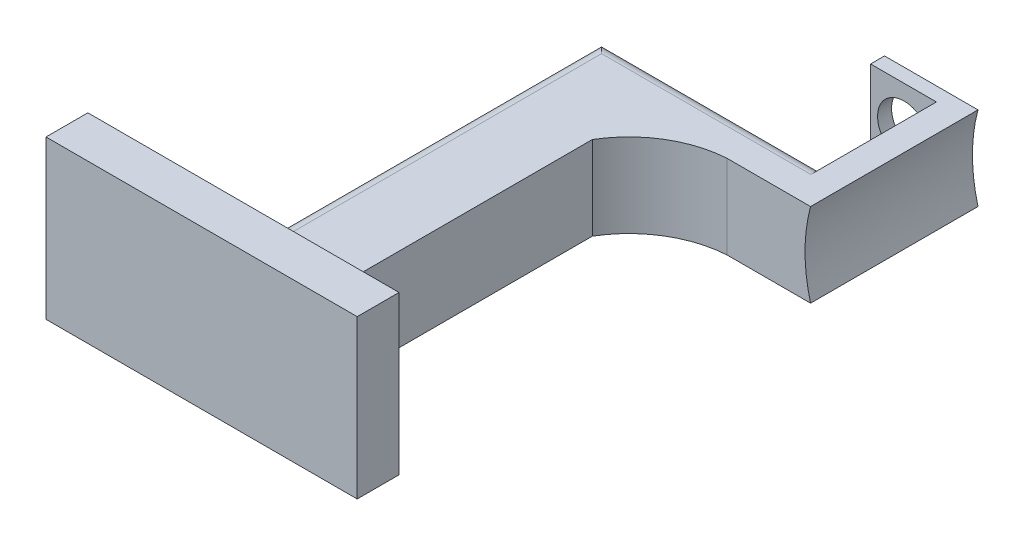
ISO-10303-21;
HEADER;
FILE_DESCRIPTION(('STEP AP214'),'2;1');
FILE_NAME('part.step','',(''),(''),'','','');
FILE_SCHEMA(('AUTOMOTIVE_DESIGN { 1 0 10303 214 1 1 1 1 }'));
ENDSEC;
DATA;
#1=APPLICATION_CONTEXT('core data for automotive mechanical design processes');
#2=APPLICATION_PROTOCOL_DEFINITION('international standard','automotive_design',2000,#1);
#3=PRODUCT_CONTEXT('',#1,'mechanical');
#4=PRODUCT('Part','Part','',(#3));
#5=PRODUCT_RELATED_PRODUCT_CATEGORY('part','',(#4));
#6=PRODUCT_DEFINITION_FORMATION('','',#4);
#7=PRODUCT_DEFINITION_CONTEXT('part definition',#1,'design');
#8=PRODUCT_DEFINITION('design','',#6,#7);
#9=PRODUCT_DEFINITION_SHAPE('','',#8);
#10=(LENGTH_UNIT() NAMED_UNIT(*) SI_UNIT(.MILLI.,.METRE.));
#11=(NAMED_UNIT(*) PLANE_ANGLE_UNIT() SI_UNIT($,.RADIAN.));
#12=(NAMED_UNIT(*) SI_UNIT($,.STERADIAN.) SOLID_ANGLE_UNIT());
#13=UNCERTAINTY_MEASURE_WITH_UNIT(LENGTH_MEASURE(1.E-05),#10,'distance_accuracy_value','');
#14=(GEOMETRIC_REPRESENTATION_CONTEXT(3) GLOBAL_UNCERTAINTY_ASSIGNED_CONTEXT((#13)) GLOBAL_UNIT_ASSIGNED_CONTEXT((#10,
#11,#12)) REPRESENTATION_CONTEXT('',''));
#15=CARTESIAN_POINT('',(0.,0.,0.));
#16=DIRECTION('',(0.,0.,1.));
#17=DIRECTION('',(1.,0.,0.));
#18=AXIS2_PLACEMENT_3D('',#15,#16,#17);
#19=CARTESIAN_POINT('',(0.,0.,12.));
#20=DIRECTION('',(0.,0.,1.));
#21=DIRECTION('',(1.,0.,0.));
#22=AXIS2_PLACEMENT_3D('',#19,#20,#21);
#23=PLANE('',#22);
#24=DIRECTION('',(-1.,0.,0.));
#25=VECTOR('',#24,1.);
#26=CARTESIAN_POINT('',(0.,3.,12.));
#27=LINE('',#26,#25);
#28=CARTESIAN_POINT('',(-11.1018016555873,3.,12.));
#29=VERTEX_POINT('',#28);
#30=CARTESIAN_POINT('',(-17.0914874300353,3.,12.));
#31=VERTEX_POINT('',#30);
#32=EDGE_CURVE('E226',#29,#31,#27,.T.);
#33=ORIENTED_EDGE('',*,*,#32,.T.);
#34=DIRECTION('',(0.,1.,0.));
#35=VECTOR('',#34,1.);
#36=CARTESIAN_POINT('',(-17.0914874300353,-10.0195302197059,12.));
#37=LINE('',#36,#35);
#38=CARTESIAN_POINT('',(-17.0914874300353,-3.,12.));
#39=VERTEX_POINT('',#38);
#40=EDGE_CURVE('E197',#39,#31,#37,.T.);
#41=ORIENTED_EDGE('',*,*,#40,.F.);
#42=DIRECTION('',(1.,0.,0.));
#43=VECTOR('',#42,1.);
#44=CARTESIAN_POINT('',(0.,-3.,12.));
#45=LINE('',#44,#43);
#46=CARTESIAN_POINT('',(-11.1018016555873,-3.,12.));
#47=VERTEX_POINT('',#46);
#48=EDGE_CURVE('E228',#39,#47,#45,.T.);
#49=ORIENTED_EDGE('',*,*,#48,.T.);
#50=CARTESIAN_POINT('',(0.,0.,12.));
#51=DIRECTION('',(0.,0.,1.));
#52=DIRECTION('',(1.,0.,0.));
#53=AXIS2_PLACEMENT_3D('',#50,#51,#52);
#54=CIRCLE('',#53,11.5);
#55=EDGE_CURVE('E230',#47,#29,#54,.F.);
#56=ORIENTED_EDGE('',*,*,#55,.T.);
#57=EDGE_LOOP('',(#33,#41,#49,#56));
#58=FACE_BOUND('',#57,.T.);
#59=ADVANCED_FACE('F37',(#58),#23,.T.);
#60=CARTESIAN_POINT('',(-23.0811732044833,3.,37.4));
#61=DIRECTION('',(-1.,0.,0.));
#62=DIRECTION('',(0.,0.,1.));
#63=AXIS2_PLACEMENT_3D('',#60,#61,#62);
#64=PLANE('',#63);
#65=DIRECTION('',(0.,0.,-1.));
#66=VECTOR('',#65,1.);
#67=CARTESIAN_POINT('',(-23.0811732044833,3.,37.4));
#68=LINE('',#67,#66);
#69=CARTESIAN_POINT('',(-23.0811732044833,3.,36.9));
#70=VERTEX_POINT('',#69);
#71=CARTESIAN_POINT('',(-23.0811732044833,3.,15.6602552955688));
#72=VERTEX_POINT('',#71);
#73=EDGE_CURVE('E205',#70,#72,#68,.T.);
#74=ORIENTED_EDGE('',*,*,#73,.F.);
#75=DIRECTION('',(0.,1.,0.));
#76=VECTOR('',#75,1.);
#77=CARTESIAN_POINT('',(-23.0811732044833,3.,36.9));
#78=LINE('',#77,#76);
#79=CARTESIAN_POINT('',(-23.0811732044833,-3.,36.9));
#80=VERTEX_POINT('',#79);
#81=EDGE_CURVE('E281',#70,#80,#78,.F.);
#82=ORIENTED_EDGE('',*,*,#81,.T.);
#83=DIRECTION('',(0.,0.,-1.));
#84=VECTOR('',#83,1.);
#85=CARTESIAN_POINT('',(-23.0811732044833,-3.,37.4));
#86=LINE('',#85,#84);
#87=CARTESIAN_POINT('',(-23.0811732044833,-3.,15.6602552955688));
#88=VERTEX_POINT('',#87);
#89=EDGE_CURVE('E213',#80,#88,#86,.T.);
#90=ORIENTED_EDGE('',*,*,#89,.T.);
#91=DIRECTION('',(0.,1.,0.));
#92=VECTOR('',#91,1.);
#93=CARTESIAN_POINT('',(-23.0811732044833,-10.0195302197059,15.6602552955688));
#94=LINE('',#93,#92);
#95=EDGE_CURVE('E206',#88,#72,#94,.T.);
#96=ORIENTED_EDGE('',*,*,#95,.T.);
#97=EDGE_LOOP('',(#74,#82,#90,#96));
#98=FACE_BOUND('',#97,.T.);
#99=ADVANCED_FACE('F357',(#98),#64,.F.);
#100=CARTESIAN_POINT('',(-13.0811732044833,0.,12.));
#101=DIRECTION('',(1.,0.,0.));
#102=DIRECTION('',(0.,0.,-1.));
#103=AXIS2_PLACEMENT_3D('',#100,#101,#102);
#104=PLANE('',#103);
#105=DIRECTION('',(0.,-1.,0.));
#106=VECTOR('',#105,1.);
#107=CARTESIAN_POINT('',(-13.0811732044833,0.,9.00000000000001));
#108=LINE('',#107,#106);
#109=CARTESIAN_POINT('',(-13.0811732044833,2.,9.00000000000001));
#110=VERTEX_POINT('',#109);
#111=CARTESIAN_POINT('',(-13.0811732044833,-3.,9.00000000000001));
#112=VERTEX_POINT('',#111);
#113=EDGE_CURVE('E220',#110,#112,#108,.T.);
#114=ORIENTED_EDGE('',*,*,#113,.F.);
#115=CARTESIAN_POINT('',(-13.0811732044833,2.,10.));
#116=DIRECTION('',(1.,0.,0.));
#117=DIRECTION('',(0.,0.,-1.));
#118=AXIS2_PLACEMENT_3D('',#115,#116,#117);
#119=CIRCLE('',#118,1.);
#120=CARTESIAN_POINT('',(-13.0811732044833,3.,10.));
#121=VERTEX_POINT('',#120);
#122=EDGE_CURVE('E11',#110,#121,#119,.T.);
#123=ORIENTED_EDGE('',*,*,#122,.T.);
#124=DIRECTION('',(0.,0.,-1.));
#125=VECTOR('',#124,1.);
#126=CARTESIAN_POINT('',(-13.0811732044833,3.,12.));
#127=LINE('',#126,#125);
#128=CARTESIAN_POINT('',(-13.0811732044833,3.,1.));
#129=VERTEX_POINT('',#128);
#130=EDGE_CURVE('E237',#121,#129,#127,.T.);
#131=ORIENTED_EDGE('',*,*,#130,.T.);
#132=DIRECTION('',(0.,-1.,0.));
#133=VECTOR('',#132,1.);
#134=CARTESIAN_POINT('',(-13.0811732044833,0.,1.));
#135=LINE('',#134,#133);
#136=CARTESIAN_POINT('',(-13.0811732044833,-3.,1.));
#137=VERTEX_POINT('',#136);
#138=EDGE_CURVE('E225',#129,#137,#135,.T.);
#139=ORIENTED_EDGE('',*,*,#138,.T.);
#140=DIRECTION('',(0.,0.,-1.));
#141=VECTOR('',#140,1.);
#142=CARTESIAN_POINT('',(-13.0811732044833,-3.,12.));
#143=LINE('',#142,#141);
#144=EDGE_CURVE('E233',#112,#137,#143,.T.);
#145=ORIENTED_EDGE('',*,*,#144,.F.);
#146=EDGE_LOOP('',(#114,#123,#131,#139,#145));
#147=FACE_BOUND('',#146,.T.);
#148=ADVANCED_FACE('F330',(#147),#104,.F.);
#149=CARTESIAN_POINT('',(0.,-3.,1.));
#150=DIRECTION('',(0.,1.,0.));
#151=DIRECTION('',(0.,0.,1.));
#152=AXIS2_PLACEMENT_3D('',#149,#150,#151);
#153=PLANE('',#152);
#154=ORIENTED_EDGE('',*,*,#48,.F.);
#155=CARTESIAN_POINT('',(-16.6196841429409,-3.,19.5029891283749));
#156=DIRECTION('',(0.,1.,0.));
#157=DIRECTION('',(0.,0.,1.));
#158=AXIS2_PLACEMENT_3D('',#155,#156,#157);
#159=CIRCLE('',#158,7.5178084707064);
#160=EDGE_CURVE('E203',#88,#39,#159,.F.);
#161=ORIENTED_EDGE('',*,*,#160,.F.);
#162=ORIENTED_EDGE('',*,*,#89,.F.);
#163=CARTESIAN_POINT('',(-22.5811732044833,-3.,36.9));
#164=DIRECTION('',(0.,1.,0.));
#165=DIRECTION('',(0.,0.,1.));
#166=AXIS2_PLACEMENT_3D('',#163,#164,#165);
#167=CIRCLE('',#166,0.5);
#168=CARTESIAN_POINT('',(-22.5811732044833,-3.,37.4));
#169=VERTEX_POINT('',#168);
#170=EDGE_CURVE('E287',#80,#169,#167,.T.);
#171=ORIENTED_EDGE('',*,*,#170,.T.);
#172=DIRECTION('',(1.,0.,0.));
#173=VECTOR('',#172,1.);
#174=CARTESIAN_POINT('',(-37.4975494486627,-3.,37.4));
#175=LINE('',#174,#173);
#176=CARTESIAN_POINT('',(-15.1952918483644,-3.,37.4));
#177=VERTEX_POINT('',#176);
#178=EDGE_CURVE('E619',#169,#177,#175,.T.);
#179=ORIENTED_EDGE('',*,*,#178,.T.);
#180=DIRECTION('',(0.,0.,-1.));
#181=VECTOR('',#180,1.);
#182=CARTESIAN_POINT('',(-15.1952918483644,-3.,40.4));
#183=LINE('',#182,#181);
#184=CARTESIAN_POINT('',(-15.1952918483644,-3.,40.4));
#185=VERTEX_POINT('',#184);
#186=EDGE_CURVE('E176',#185,#177,#183,.T.);
#187=ORIENTED_EDGE('',*,*,#186,.F.);
#188=DIRECTION('',(1.,0.,0.));
#189=VECTOR('',#188,1.);
#190=CARTESIAN_POINT('',(-37.4975494486627,-3.,40.4));
#191=LINE('',#190,#189);
#192=CARTESIAN_POINT('',(-37.4975494486627,-3.,40.4));
#193=VERTEX_POINT('',#192);
#194=EDGE_CURVE('E167',#193,#185,#191,.T.);
#195=ORIENTED_EDGE('',*,*,#194,.F.);
#196=DIRECTION('',(0.,0.,-1.));
#197=VECTOR('',#196,1.);
#198=CARTESIAN_POINT('',(-37.4975494486627,-3.,40.4));
#199=LINE('',#198,#197);
#200=CARTESIAN_POINT('',(-37.4975494486627,-3.,37.4));
#201=VERTEX_POINT('',#200);
#202=EDGE_CURVE('E173',#193,#201,#199,.T.);
#203=ORIENTED_EDGE('',*,*,#202,.T.);
#204=CARTESIAN_POINT('',(-29.5811732044833,-3.,37.4));
#205=VERTEX_POINT('',#204);
#206=EDGE_CURVE('E642',#201,#205,#175,.T.);
#207=ORIENTED_EDGE('',*,*,#206,.T.);
#208=CARTESIAN_POINT('',(-29.5811732044833,-3.,36.9));
#209=DIRECTION('',(0.,1.,0.));
#210=DIRECTION('',(0.,0.,1.));
#211=AXIS2_PLACEMENT_3D('',#208,#209,#210);
#212=CIRCLE('',#211,0.5);
#213=CARTESIAN_POINT('',(-29.0811732044833,-3.,36.9));
#214=VERTEX_POINT('',#213);
#215=EDGE_CURVE('E289',#205,#214,#212,.T.);
#216=ORIENTED_EDGE('',*,*,#215,.T.);
#217=DIRECTION('',(0.,0.,1.));
#218=VECTOR('',#217,1.);
#219=CARTESIAN_POINT('',(-29.0811732044833,-3.,9.00000000000001));
#220=LINE('',#219,#218);
#221=CARTESIAN_POINT('',(-29.0811732044833,-3.,9.00000000000001));
#222=VERTEX_POINT('',#221);
#223=EDGE_CURVE('E222',#222,#214,#220,.T.);
#224=ORIENTED_EDGE('',*,*,#223,.F.);
#225=DIRECTION('',(-1.,0.,0.));
#226=VECTOR('',#225,1.);
#227=CARTESIAN_POINT('',(0.,-3.,9.00000000000001));
#228=LINE('',#227,#226);
#229=EDGE_CURVE('E217',#112,#222,#228,.T.);
#230=ORIENTED_EDGE('',*,*,#229,.F.);
#231=ORIENTED_EDGE('',*,*,#144,.T.);
#232=DIRECTION('',(1.,0.,0.));
#233=VECTOR('',#232,1.);
#234=CARTESIAN_POINT('',(0.,-3.,1.));
#235=LINE('',#234,#233);
#236=CARTESIAN_POINT('',(-17.8,-3.,1.));
#237=VERTEX_POINT('',#236);
#238=EDGE_CURVE('E240',#237,#137,#235,.T.);
#239=ORIENTED_EDGE('',*,*,#238,.F.);
#240=DIRECTION('',(0.,0.,-1.));
#241=VECTOR('',#240,1.);
#242=CARTESIAN_POINT('',(-17.8,-3.,1.));
#243=LINE('',#242,#241);
#244=CARTESIAN_POINT('',(-17.8,-3.,0.));
#245=VERTEX_POINT('',#244);
#246=EDGE_CURVE('E252',#237,#245,#243,.T.);
#247=ORIENTED_EDGE('',*,*,#246,.T.);
#248=DIRECTION('',(1.,0.,0.));
#249=VECTOR('',#248,1.);
#250=CARTESIAN_POINT('',(0.,-3.,0.));
#251=LINE('',#250,#249);
#252=CARTESIAN_POINT('',(-11.1018016555873,-3.,0.));
#253=VERTEX_POINT('',#252);
#254=EDGE_CURVE('E239',#245,#253,#251,.T.);
#255=ORIENTED_EDGE('',*,*,#254,.T.);
#256=DIRECTION('',(0.,0.,-1.));
#257=VECTOR('',#256,1.);
#258=CARTESIAN_POINT('',(-11.1018016555873,-3.,1.));
#259=LINE('',#258,#257);
#260=EDGE_CURVE('E271',#47,#253,#259,.T.);
#261=ORIENTED_EDGE('',*,*,#260,.F.);
#262=EDGE_LOOP('',(#154,#161,#162,#171,#179,#187,#195,#203,#207,#216,#224,#230,#231,#239,#247,
#255,#261));
#263=FACE_BOUND('',#262,.T.);
#264=ADVANCED_FACE('F170',(#263),#153,.F.);
#265=CARTESIAN_POINT('',(0.,0.,1.));
#266=DIRECTION('',(0.,0.,-1.));
#267=DIRECTION('',(-1.,0.,0.));
#268=AXIS2_PLACEMENT_3D('',#265,#266,#267);
#269=CYLINDRICAL_SURFACE('',#268,11.5);
#270=CARTESIAN_POINT('',(0.,0.,0.));
#271=DIRECTION('',(0.,0.,1.));
#272=DIRECTION('',(1.,0.,0.));
#273=AXIS2_PLACEMENT_3D('',#270,#271,#272);
#274=CIRCLE('',#273,11.5);
#275=CARTESIAN_POINT('',(-11.1018016555873,3.,0.));
#276=VERTEX_POINT('',#275);
#277=EDGE_CURVE('E255',#276,#253,#274,.T.);
#278=ORIENTED_EDGE('',*,*,#277,.F.);
#279=DIRECTION('',(0.,0.,-1.));
#280=VECTOR('',#279,1.);
#281=CARTESIAN_POINT('',(-11.1018016555873,3.,1.));
#282=LINE('',#281,#280);
#283=EDGE_CURVE('E269',#29,#276,#282,.T.);
#284=ORIENTED_EDGE('',*,*,#283,.F.);
#285=ORIENTED_EDGE('',*,*,#55,.F.);
#286=ORIENTED_EDGE('',*,*,#260,.T.);
#287=EDGE_LOOP('',(#278,#284,#285,#286));
#288=FACE_BOUND('',#287,.T.);
#289=ADVANCED_FACE('F329',(#288),#269,.F.);
#290=CARTESIAN_POINT('',(0.,3.,1.));
#291=DIRECTION('',(0.,1.,0.));
#292=DIRECTION('',(0.,0.,1.));
#293=AXIS2_PLACEMENT_3D('',#290,#291,#292);
#294=PLANE('',#293);
#295=ORIENTED_EDGE('',*,*,#130,.F.);
#296=DIRECTION('',(-1.,0.,0.));
#297=VECTOR('',#296,1.);
#298=CARTESIAN_POINT('',(-29.0811732044833,3.,10.));
#299=LINE('',#298,#297);
#300=CARTESIAN_POINT('',(-28.0811732044833,3.,10.));
#301=VERTEX_POINT('',#300);
#302=EDGE_CURVE('E300',#121,#301,#299,.T.);
#303=ORIENTED_EDGE('',*,*,#302,.T.);
#304=DIRECTION('',(0.,0.,1.));
#305=VECTOR('',#304,1.);
#306=CARTESIAN_POINT('',(-28.0811732044833,3.,1.));
#307=LINE('',#306,#305);
#308=CARTESIAN_POINT('',(-28.0811732044833,3.,36.9));
#309=VERTEX_POINT('',#308);
#310=EDGE_CURVE('E298',#301,#309,#307,.T.);
#311=ORIENTED_EDGE('',*,*,#310,.T.);
#312=DIRECTION('',(-1.,0.,0.));
#313=VECTOR('',#312,1.);
#314=CARTESIAN_POINT('',(-23.0811732044833,3.,36.9));
#315=LINE('',#314,#313);
#316=EDGE_CURVE('E285',#309,#70,#315,.F.);
#317=ORIENTED_EDGE('',*,*,#316,.T.);
#318=ORIENTED_EDGE('',*,*,#73,.T.);
#319=CARTESIAN_POINT('',(-16.6196841429409,3.,19.5029891283749));
#320=DIRECTION('',(0.,1.,0.));
#321=DIRECTION('',(0.,0.,1.));
#322=AXIS2_PLACEMENT_3D('',#319,#320,#321);
#323=CIRCLE('',#322,7.5178084707064);
#324=EDGE_CURVE('E194',#31,#72,#323,.T.);
#325=ORIENTED_EDGE('',*,*,#324,.F.);
#326=ORIENTED_EDGE('',*,*,#32,.F.);
#327=ORIENTED_EDGE('',*,*,#283,.T.);
#328=DIRECTION('',(1.,0.,0.));
#329=VECTOR('',#328,1.);
#330=CARTESIAN_POINT('',(0.,3.,0.));
#331=LINE('',#330,#329);
#332=CARTESIAN_POINT('',(-17.8,3.,0.));
#333=VERTEX_POINT('',#332);
#334=EDGE_CURVE('E258',#333,#276,#331,.T.);
#335=ORIENTED_EDGE('',*,*,#334,.F.);
#336=DIRECTION('',(0.,0.,-1.));
#337=VECTOR('',#336,1.);
#338=CARTESIAN_POINT('',(-17.8,3.,1.));
#339=LINE('',#338,#337);
#340=CARTESIAN_POINT('',(-17.8,3.,1.));
#341=VERTEX_POINT('',#340);
#342=EDGE_CURVE('E267',#341,#333,#339,.T.);
#343=ORIENTED_EDGE('',*,*,#342,.F.);
#344=DIRECTION('',(1.,0.,0.));
#345=VECTOR('',#344,1.);
#346=CARTESIAN_POINT('',(0.,3.,1.));
#347=LINE('',#346,#345);
#348=EDGE_CURVE('E243',#341,#129,#347,.T.);
#349=ORIENTED_EDGE('',*,*,#348,.T.);
#350=EDGE_LOOP('',(#295,#303,#311,#317,#318,#325,#326,#327,#335,#343,#349));
#351=FACE_BOUND('',#350,.T.);
#352=ADVANCED_FACE('F333',(#351),#294,.T.);
#353=CARTESIAN_POINT('',(-17.8,0.,1.));
#354=DIRECTION('',(1.,0.,0.));
#355=DIRECTION('',(0.,0.,-1.));
#356=AXIS2_PLACEMENT_3D('',#353,#354,#355);
#357=PLANE('',#356);
#358=DIRECTION('',(0.,-1.,0.));
#359=VECTOR('',#358,1.);
#360=CARTESIAN_POINT('',(-17.8,0.,0.));
#361=LINE('',#360,#359);
#362=EDGE_CURVE('E261',#333,#245,#361,.T.);
#363=ORIENTED_EDGE('',*,*,#362,.T.);
#364=ORIENTED_EDGE('',*,*,#246,.F.);
#365=DIRECTION('',(0.,-1.,0.));
#366=VECTOR('',#365,1.);
#367=CARTESIAN_POINT('',(-17.8,0.,1.));
#368=LINE('',#367,#366);
#369=EDGE_CURVE('E247',#341,#237,#368,.T.);
#370=ORIENTED_EDGE('',*,*,#369,.F.);
#371=ORIENTED_EDGE('',*,*,#342,.T.);
#372=EDGE_LOOP('',(#363,#364,#370,#371));
#373=FACE_BOUND('',#372,.T.);
#374=ADVANCED_FACE('F337',(#373),#357,.F.);
#375=CARTESIAN_POINT('',(-15.4,0.,1.));
#376=DIRECTION('',(0.,0.,-1.));
#377=DIRECTION('',(-1.,0.,0.));
#378=AXIS2_PLACEMENT_3D('',#375,#376,#377);
#379=CYLINDRICAL_SURFACE('',#378,1.9);
#380=CARTESIAN_POINT('',(-15.4,0.,1.));
#381=DIRECTION('',(0.,0.,1.));
#382=DIRECTION('',(1.,0.,0.));
#383=AXIS2_PLACEMENT_3D('',#380,#381,#382);
#384=CIRCLE('',#383,1.9);
#385=CARTESIAN_POINT('',(-13.5,0.,1.));
#386=VERTEX_POINT('',#385);
#387=EDGE_CURVE('E249',#386,#386,#384,.T.);
#388=ORIENTED_EDGE('',*,*,#387,.T.);
#389=EDGE_LOOP('',(#388));
#390=FACE_BOUND('',#389,.T.);
#391=CARTESIAN_POINT('',(-15.4,0.,0.));
#392=DIRECTION('',(0.,0.,1.));
#393=DIRECTION('',(1.,0.,0.));
#394=AXIS2_PLACEMENT_3D('',#391,#392,#393);
#395=CIRCLE('',#394,1.9);
#396=CARTESIAN_POINT('',(-13.5,0.,0.));
#397=VERTEX_POINT('',#396);
#398=EDGE_CURVE('E244',#397,#397,#395,.T.);
#399=ORIENTED_EDGE('',*,*,#398,.F.);
#400=EDGE_LOOP('',(#399));
#401=FACE_BOUND('',#400,.T.);
#402=ADVANCED_FACE('F341',(#390,#401),#379,.F.);
#403=CARTESIAN_POINT('',(0.,0.,1.));
#404=DIRECTION('',(0.,0.,1.));
#405=DIRECTION('',(1.,0.,0.));
#406=AXIS2_PLACEMENT_3D('',#403,#404,#405);
#407=PLANE('',#406);
#408=ORIENTED_EDGE('',*,*,#138,.F.);
#409=ORIENTED_EDGE('',*,*,#348,.F.);
#410=ORIENTED_EDGE('',*,*,#369,.T.);
#411=ORIENTED_EDGE('',*,*,#238,.T.);
#412=EDGE_LOOP('',(#408,#409,#410,#411));
#413=FACE_BOUND('',#412,.T.);
#414=ORIENTED_EDGE('',*,*,#387,.F.);
#415=EDGE_LOOP('',(#414));
#416=FACE_BOUND('',#415,.T.);
#417=ADVANCED_FACE('F345',(#413,#416),#407,.T.);
#418=CARTESIAN_POINT('',(0.,0.,0.));
#419=DIRECTION('',(0.,0.,1.));
#420=DIRECTION('',(1.,0.,0.));
#421=AXIS2_PLACEMENT_3D('',#418,#419,#420);
#422=PLANE('',#421);
#423=ORIENTED_EDGE('',*,*,#254,.F.);
#424=ORIENTED_EDGE('',*,*,#362,.F.);
#425=ORIENTED_EDGE('',*,*,#334,.T.);
#426=ORIENTED_EDGE('',*,*,#277,.T.);
#427=EDGE_LOOP('',(#423,#424,#425,#426));
#428=FACE_BOUND('',#427,.T.);
#429=ORIENTED_EDGE('',*,*,#398,.T.);
#430=EDGE_LOOP('',(#429));
#431=FACE_BOUND('',#430,.T.);
#432=ADVANCED_FACE('F347',(#428,#431),#422,.F.);
#433=CARTESIAN_POINT('',(-29.0811732044833,0.,9.00000000000001));
#434=DIRECTION('',(-1.,0.,0.));
#435=DIRECTION('',(0.,0.,1.));
#436=AXIS2_PLACEMENT_3D('',#433,#434,#435);
#437=PLANE('',#436);
#438=DIRECTION('',(0.,-1.,0.));
#439=VECTOR('',#438,1.);
#440=CARTESIAN_POINT('',(-29.0811732044833,3.,36.9));
#441=LINE('',#440,#439);
#442=CARTESIAN_POINT('',(-29.0811732044833,2.,36.9));
#443=VERTEX_POINT('',#442);
#444=EDGE_CURVE('E283',#214,#443,#441,.F.);
#445=ORIENTED_EDGE('',*,*,#444,.T.);
#446=DIRECTION('',(0.,0.,1.));
#447=VECTOR('',#446,1.);
#448=CARTESIAN_POINT('',(-29.0811732044833,2.,9.00000000000001));
#449=LINE('',#448,#447);
#450=CARTESIAN_POINT('',(-29.0811732044833,2.,9.00000000000001));
#451=VERTEX_POINT('',#450);
#452=EDGE_CURVE('E46',#443,#451,#449,.F.);
#453=ORIENTED_EDGE('',*,*,#452,.T.);
#454=DIRECTION('',(0.,-1.,0.));
#455=VECTOR('',#454,1.);
#456=CARTESIAN_POINT('',(-29.0811732044833,0.,9.00000000000001));
#457=LINE('',#456,#455);
#458=EDGE_CURVE('E215',#451,#222,#457,.T.);
#459=ORIENTED_EDGE('',*,*,#458,.T.);
#460=ORIENTED_EDGE('',*,*,#223,.T.);
#461=EDGE_LOOP('',(#445,#453,#459,#460));
#462=FACE_BOUND('',#461,.T.);
#463=ADVANCED_FACE('F350',(#462),#437,.T.);
#464=CARTESIAN_POINT('',(0.,0.,9.00000000000001));
#465=DIRECTION('',(0.,0.,1.));
#466=DIRECTION('',(1.,0.,0.));
#467=AXIS2_PLACEMENT_3D('',#464,#465,#466);
#468=PLANE('',#467);
#469=ORIENTED_EDGE('',*,*,#458,.F.);
#470=DIRECTION('',(-1.,0.,0.));
#471=VECTOR('',#470,1.);
#472=CARTESIAN_POINT('',(-13.0811732044833,2.,9.00000000000001));
#473=LINE('',#472,#471);
#474=EDGE_CURVE('E60',#451,#110,#473,.F.);
#475=ORIENTED_EDGE('',*,*,#474,.T.);
#476=ORIENTED_EDGE('',*,*,#113,.T.);
#477=ORIENTED_EDGE('',*,*,#229,.T.);
#478=EDGE_LOOP('',(#469,#475,#476,#477));
#479=FACE_BOUND('',#478,.T.);
#480=ADVANCED_FACE('F364',(#479),#468,.F.);
#481=CARTESIAN_POINT('',(-16.6196841429409,-10.0195302197059,19.5029891283749));
#482=DIRECTION('',(0.,1.,0.));
#483=DIRECTION('',(0.,0.,1.));
#484=AXIS2_PLACEMENT_3D('',#481,#482,#483);
#485=CYLINDRICAL_SURFACE('',#484,7.5178084707064);
#486=ORIENTED_EDGE('',*,*,#95,.F.);
#487=ORIENTED_EDGE('',*,*,#160,.T.);
#488=ORIENTED_EDGE('',*,*,#40,.T.);
#489=ORIENTED_EDGE('',*,*,#324,.T.);
#490=EDGE_LOOP('',(#486,#487,#488,#489));
#491=FACE_BOUND('',#490,.T.);
#492=ADVANCED_FACE('F367',(#491),#485,.F.);
#493=CARTESIAN_POINT('',(-37.4975494486627,-3.,40.4));
#494=DIRECTION('',(1.,0.,0.));
#495=DIRECTION('',(0.,0.,-1.));
#496=AXIS2_PLACEMENT_3D('',#493,#494,#495);
#497=PLANE('',#496);
#498=DIRECTION('',(0.,-1.,0.));
#499=VECTOR('',#498,1.);
#500=CARTESIAN_POINT('',(-37.4975494486627,-3.,37.4));
#501=LINE('',#500,#499);
#502=CARTESIAN_POINT('',(-37.4975494486627,8.32002405134347,37.4));
#503=VERTEX_POINT('',#502);
#504=EDGE_CURVE('E193',#503,#201,#501,.T.);
#505=ORIENTED_EDGE('',*,*,#504,.T.);
#506=ORIENTED_EDGE('',*,*,#202,.F.);
#507=DIRECTION('',(0.,-1.,0.));
#508=VECTOR('',#507,1.);
#509=CARTESIAN_POINT('',(-37.4975494486627,-3.,40.4));
#510=LINE('',#509,#508);
#511=CARTESIAN_POINT('',(-37.4975494486627,8.32002405134347,40.4));
#512=VERTEX_POINT('',#511);
#513=EDGE_CURVE('E180',#512,#193,#510,.T.);
#514=ORIENTED_EDGE('',*,*,#513,.F.);
#515=DIRECTION('',(0.,0.,-1.));
#516=VECTOR('',#515,1.);
#517=CARTESIAN_POINT('',(-37.4975494486627,8.32002405134347,40.4));
#518=LINE('',#517,#516);
#519=EDGE_CURVE('E652',#512,#503,#518,.T.);
#520=ORIENTED_EDGE('',*,*,#519,.T.);
#521=EDGE_LOOP('',(#505,#506,#514,#520));
#522=FACE_BOUND('',#521,.T.);
#523=ADVANCED_FACE('F191',(#522),#497,.F.);
#524=CARTESIAN_POINT('',(-15.1952918483644,-3.,40.4));
#525=DIRECTION('',(-1.,0.,0.));
#526=DIRECTION('',(0.,0.,1.));
#527=AXIS2_PLACEMENT_3D('',#524,#525,#526);
#528=PLANE('',#527);
#529=DIRECTION('',(0.,1.,0.));
#530=VECTOR('',#529,1.);
#531=CARTESIAN_POINT('',(-15.1952918483644,-3.,37.4));
#532=LINE('',#531,#530);
#533=CARTESIAN_POINT('',(-15.1952918483644,8.32002405134347,37.4));
#534=VERTEX_POINT('',#533);
#535=EDGE_CURVE('E645',#177,#534,#532,.T.);
#536=ORIENTED_EDGE('',*,*,#535,.T.);
#537=DIRECTION('',(0.,0.,-1.));
#538=VECTOR('',#537,1.);
#539=CARTESIAN_POINT('',(-15.1952918483644,8.32002405134347,40.4));
#540=LINE('',#539,#538);
#541=CARTESIAN_POINT('',(-15.1952918483644,8.32002405134347,40.4));
#542=VERTEX_POINT('',#541);
#543=EDGE_CURVE('E199',#542,#534,#540,.T.);
#544=ORIENTED_EDGE('',*,*,#543,.F.);
#545=DIRECTION('',(0.,1.,0.));
#546=VECTOR('',#545,1.);
#547=CARTESIAN_POINT('',(-15.1952918483644,-3.,40.4));
#548=LINE('',#547,#546);
#549=EDGE_CURVE('E179',#185,#542,#548,.T.);
#550=ORIENTED_EDGE('',*,*,#549,.F.);
#551=ORIENTED_EDGE('',*,*,#186,.T.);
#552=EDGE_LOOP('',(#536,#544,#550,#551));
#553=FACE_BOUND('',#552,.T.);
#554=ADVANCED_FACE('F376',(#553),#528,.F.);
#555=CARTESIAN_POINT('',(-37.4975494486627,8.32002405134347,40.4));
#556=DIRECTION('',(0.,-1.,0.));
#557=DIRECTION('',(0.,0.,-1.));
#558=AXIS2_PLACEMENT_3D('',#555,#556,#557);
#559=PLANE('',#558);
#560=DIRECTION('',(-1.,0.,0.));
#561=VECTOR('',#560,1.);
#562=CARTESIAN_POINT('',(-37.4975494486627,8.32002405134347,37.4));
#563=LINE('',#562,#561);
#564=EDGE_CURVE('E189',#534,#503,#563,.T.);
#565=ORIENTED_EDGE('',*,*,#564,.T.);
#566=ORIENTED_EDGE('',*,*,#519,.F.);
#567=DIRECTION('',(-1.,0.,0.));
#568=VECTOR('',#567,1.);
#569=CARTESIAN_POINT('',(-37.4975494486627,8.32002405134347,40.4));
#570=LINE('',#569,#568);
#571=EDGE_CURVE('E185',#542,#512,#570,.T.);
#572=ORIENTED_EDGE('',*,*,#571,.F.);
#573=ORIENTED_EDGE('',*,*,#543,.T.);
#574=EDGE_LOOP('',(#565,#566,#572,#573));
#575=FACE_BOUND('',#574,.T.);
#576=ADVANCED_FACE('F379',(#575),#559,.F.);
#577=CARTESIAN_POINT('',(0.,0.,40.4));
#578=DIRECTION('',(0.,0.,-1.));
#579=DIRECTION('',(-1.,0.,0.));
#580=AXIS2_PLACEMENT_3D('',#577,#578,#579);
#581=PLANE('',#580);
#582=ORIENTED_EDGE('',*,*,#513,.T.);
#583=ORIENTED_EDGE('',*,*,#194,.T.);
#584=ORIENTED_EDGE('',*,*,#549,.T.);
#585=ORIENTED_EDGE('',*,*,#571,.T.);
#586=EDGE_LOOP('',(#582,#583,#584,#585));
#587=FACE_BOUND('',#586,.T.);
#588=ADVANCED_FACE('F183',(#587),#581,.F.);
#589=CARTESIAN_POINT('',(0.,0.,37.4));
#590=DIRECTION('',(0.,0.,-1.));
#591=DIRECTION('',(-1.,0.,0.));
#592=AXIS2_PLACEMENT_3D('',#589,#590,#591);
#593=PLANE('',#592);
#594=ORIENTED_EDGE('',*,*,#178,.F.);
#595=DIRECTION('',(0.,1.,0.));
#596=VECTOR('',#595,1.);
#597=CARTESIAN_POINT('',(-22.5811732044833,0.,37.4));
#598=LINE('',#597,#596);
#599=CARTESIAN_POINT('',(-22.5811732044833,3.5,37.4));
#600=VERTEX_POINT('',#599);
#601=EDGE_CURVE('E278',#169,#600,#598,.T.);
#602=ORIENTED_EDGE('',*,*,#601,.T.);
#603=DIRECTION('',(-1.,0.,0.));
#604=VECTOR('',#603,1.);
#605=CARTESIAN_POINT('',(-29.0811732044833,3.5,37.4));
#606=LINE('',#605,#604);
#607=CARTESIAN_POINT('',(-29.5811732044833,3.5,37.4));
#608=VERTEX_POINT('',#607);
#609=EDGE_CURVE('E273',#600,#608,#606,.T.);
#610=ORIENTED_EDGE('',*,*,#609,.T.);
#611=DIRECTION('',(0.,-1.,0.));
#612=VECTOR('',#611,1.);
#613=CARTESIAN_POINT('',(-29.5811732044833,-3.,37.4));
#614=LINE('',#613,#612);
#615=EDGE_CURVE('E276',#608,#205,#614,.T.);
#616=ORIENTED_EDGE('',*,*,#615,.T.);
#617=ORIENTED_EDGE('',*,*,#206,.F.);
#618=ORIENTED_EDGE('',*,*,#504,.F.);
#619=ORIENTED_EDGE('',*,*,#564,.F.);
#620=ORIENTED_EDGE('',*,*,#535,.F.);
#621=EDGE_LOOP('',(#594,#602,#610,#616,#617,#618,#619,#620));
#622=FACE_BOUND('',#621,.T.);
#623=ADVANCED_FACE('F384',(#622),#593,.T.);
#624=CARTESIAN_POINT('',(-29.5811732044833,0.,36.9));
#625=DIRECTION('',(0.,1.,0.));
#626=DIRECTION('',(0.,0.,1.));
#627=AXIS2_PLACEMENT_3D('',#624,#625,#626);
#628=CYLINDRICAL_SURFACE('',#627,0.5);
#629=ORIENTED_EDGE('',*,*,#615,.F.);
#630=CARTESIAN_POINT('',(-29.5811732044833,3.5,36.9));
#631=DIRECTION('',(-0.948683298050513,-0.316227766016838,0.));
#632=DIRECTION('',(0.316227766016838,-0.948683298050514,0.));
#633=AXIS2_PLACEMENT_3D('',#630,#631,#632);
#634=ELLIPSE('',#633,1.58113883008419,0.5);
#635=EDGE_CURVE('E296',#608,#443,#634,.F.);
#636=ORIENTED_EDGE('',*,*,#635,.T.);
#637=ORIENTED_EDGE('',*,*,#444,.F.);
#638=ORIENTED_EDGE('',*,*,#215,.F.);
#639=EDGE_LOOP('',(#629,#636,#637,#638));
#640=FACE_BOUND('',#639,.T.);
#641=ADVANCED_FACE('F316',(#640),#628,.F.);
#642=CARTESIAN_POINT('',(0.,3.5,36.9));
#643=DIRECTION('',(1.,0.,0.));
#644=DIRECTION('',(0.,0.,-1.));
#645=AXIS2_PLACEMENT_3D('',#642,#643,#644);
#646=CYLINDRICAL_SURFACE('',#645,0.5);
#647=ORIENTED_EDGE('',*,*,#316,.F.);
#648=CARTESIAN_POINT('',(-29.5811732044833,3.5,36.9));
#649=DIRECTION('',(-0.316227766016838,-0.948683298050514,0.));
#650=DIRECTION('',(0.948683298050514,-0.316227766016838,0.));
#651=AXIS2_PLACEMENT_3D('',#648,#649,#650);
#652=ELLIPSE('',#651,1.58113883008419,0.5);
#653=EDGE_CURVE('E291',#309,#608,#652,.T.);
#654=ORIENTED_EDGE('',*,*,#653,.T.);
#655=ORIENTED_EDGE('',*,*,#609,.F.);
#656=CARTESIAN_POINT('',(-22.5811732044833,3.5,36.9));
#657=DIRECTION('',(0.707106781186547,-0.707106781186547,0.));
#658=DIRECTION('',(0.707106781186547,0.707106781186547,0.));
#659=AXIS2_PLACEMENT_3D('',#656,#657,#658);
#660=ELLIPSE('',#659,0.707106781186547,0.5);
#661=EDGE_CURVE('E292',#70,#600,#660,.F.);
#662=ORIENTED_EDGE('',*,*,#661,.F.);
#663=EDGE_LOOP('',(#647,#654,#655,#662));
#664=FACE_BOUND('',#663,.T.);
#665=ADVANCED_FACE('F318',(#664),#646,.F.);
#666=CARTESIAN_POINT('',(-22.5811732044833,0.,36.9));
#667=DIRECTION('',(0.,1.,0.));
#668=DIRECTION('',(0.,0.,1.));
#669=AXIS2_PLACEMENT_3D('',#666,#667,#668);
#670=CYLINDRICAL_SURFACE('',#669,0.5);
#671=ORIENTED_EDGE('',*,*,#170,.F.);
#672=ORIENTED_EDGE('',*,*,#81,.F.);
#673=ORIENTED_EDGE('',*,*,#661,.T.);
#674=ORIENTED_EDGE('',*,*,#601,.F.);
#675=EDGE_LOOP('',(#671,#672,#673,#674));
#676=FACE_BOUND('',#675,.T.);
#677=ADVANCED_FACE('F322',(#676),#670,.F.);
#678=CARTESIAN_POINT('',(0.,2.,10.));
#679=DIRECTION('',(1.,0.,0.));
#680=DIRECTION('',(0.,0.,-1.));
#681=AXIS2_PLACEMENT_3D('',#678,#679,#680);
#682=CYLINDRICAL_SURFACE('',#681,1.);
#683=ORIENTED_EDGE('',*,*,#122,.F.);
#684=ORIENTED_EDGE('',*,*,#474,.F.);
#685=CARTESIAN_POINT('',(-28.0811732044833,2.,10.));
#686=DIRECTION('',(-0.707106781186547,0.,0.707106781186547));
#687=DIRECTION('',(0.707106781186547,0.,0.707106781186547));
#688=AXIS2_PLACEMENT_3D('',#685,#686,#687);
#689=ELLIPSE('',#688,1.41421356237309,1.);
#690=EDGE_CURVE('E41',#301,#451,#689,.T.);
#691=ORIENTED_EDGE('',*,*,#690,.F.);
#692=ORIENTED_EDGE('',*,*,#302,.F.);
#693=EDGE_LOOP('',(#683,#684,#691,#692));
#694=FACE_BOUND('',#693,.T.);
#695=ADVANCED_FACE('F39',(#694),#682,.T.);
#696=CARTESIAN_POINT('',(-28.0811732044833,2.,1.));
#697=DIRECTION('',(0.,0.,1.));
#698=DIRECTION('',(1.,0.,0.));
#699=AXIS2_PLACEMENT_3D('',#696,#697,#698);
#700=CYLINDRICAL_SURFACE('',#699,1.);
#701=ORIENTED_EDGE('',*,*,#690,.T.);
#702=ORIENTED_EDGE('',*,*,#452,.F.);
#703=CARTESIAN_POINT('',(-28.0811732044833,2.,36.9));
#704=DIRECTION('',(0.,0.,1.));
#705=DIRECTION('',(1.,0.,0.));
#706=AXIS2_PLACEMENT_3D('',#703,#704,#705);
#707=CIRCLE('',#706,1.);
#708=EDGE_CURVE('E304',#309,#443,#707,.T.);
#709=ORIENTED_EDGE('',*,*,#708,.F.);
#710=ORIENTED_EDGE('',*,*,#310,.F.);
#711=EDGE_LOOP('',(#701,#702,#709,#710));
#712=FACE_BOUND('',#711,.T.);
#713=ADVANCED_FACE('F314',(#712),#700,.T.);
#714=CARTESIAN_POINT('',(-29.5811732044833,3.5,37.4));
#715=CARTESIAN_POINT('',(-29.5811732044833,3.5,37.4));
#716=CARTESIAN_POINT('',(-29.5811732044833,3.5,37.4));
#717=CARTESIAN_POINT('',(-29.5158260838276,3.4782176264481,37.3999912361875));
#718=CARTESIAN_POINT('',(-29.5375994387927,3.45642623430934,37.4001102114289));
#719=CARTESIAN_POINT('',(-29.5593908309314,3.43465287934431,37.3999912361875));
#720=CARTESIAN_POINT('',(-29.4504622777971,3.45642969110458,37.3985758781423));
#721=CARTESIAN_POINT('',(-29.4939063314773,3.41273312699401,37.3957275647602));
#722=CARTESIAN_POINT('',(-29.5376028955879,3.36928907331376,37.3985758781423));
#723=CARTESIAN_POINT('',(-29.320858713579,3.41322850303191,37.3928932372278));
#724=CARTESIAN_POINT('',(-29.4086304870523,3.32745728256899,37.3787050616827));
#725=CARTESIAN_POINT('',(-29.4944017075152,3.23968550909572,37.3928932372278));
#726=CARTESIAN_POINT('',(-29.2566141235213,3.39181363967931,37.3886502976695));
#727=CARTESIAN_POINT('',(-29.3668005722198,3.28562736773649,37.36604052816));
#728=CARTESIAN_POINT('',(-29.4729868441626,3.17544091903794,37.3886502976695));
#729=CARTESIAN_POINT('',(-29.130343075536,3.3497232903509,37.3773709228609));
#730=CARTESIAN_POINT('',(-29.2871018899826,3.20592868549927,37.3330313988177));
#731=CARTESIAN_POINT('',(-29.4308964948342,3.04916987105272,37.3773709228609));
#732=CARTESIAN_POINT('',(-29.0682974870385,3.32904142751838,37.3703825364611));
#733=CARTESIAN_POINT('',(-29.2489889711366,3.16781576665323,37.3126380717182));
#734=CARTESIAN_POINT('',(-29.4102146320017,2.98712428255516,37.3703825364611));
#735=CARTESIAN_POINT('',(-28.9475050040033,3.28877726650666,37.3537049785767));
#736=CARTESIAN_POINT('',(-29.1785189194458,3.09734571496244,37.2654489053522));
#737=CARTESIAN_POINT('',(-29.36995047099,2.86633179951997,37.3537049785767));
#738=CARTESIAN_POINT('',(-28.8887145007133,3.26918043207667,37.3440865802214));
#739=CARTESIAN_POINT('',(-29.1459253525466,3.06475214806329,37.2385794641778));
#740=CARTESIAN_POINT('',(-29.35035363656,2.80754129623002,37.3440865802214));
#741=CARTESIAN_POINT('',(-28.7754634514734,3.23143008233002,37.3222913058341));
#742=CARTESIAN_POINT('',(-29.0881609235504,3.00698771906712,37.1803240515935));
#743=CARTESIAN_POINT('',(-29.3126032868133,2.69429024699007,37.3222913058341));
#744=CARTESIAN_POINT('',(-28.7209246464766,3.21325048066443,37.3102056112235));
#745=CARTESIAN_POINT('',(-29.0627669409562,2.98159373647288,37.1488412055831));
#746=CARTESIAN_POINT('',(-29.2944236851478,2.6397514419933,37.3102056112235));
#747=CARTESIAN_POINT('',(-28.6171470895151,3.17865796167726,37.2836617413025));
#748=CARTESIAN_POINT('',(-29.0207829847938,2.9396097803105,37.0840514894129));
#749=CARTESIAN_POINT('',(-29.2598311661606,2.53597388503179,37.2836617413025));
#750=CARTESIAN_POINT('',(-28.5677856970449,3.16220416418718,37.2693111507111));
#751=CARTESIAN_POINT('',(-29.0039903801899,2.92281717570655,37.0506282380787));
#752=CARTESIAN_POINT('',(-29.2433773686705,2.48661249256154,37.2693111507111));
#753=CARTESIAN_POINT('',(-28.4752542840701,3.13136035986227,37.2384669444593));
#754=CARTESIAN_POINT('',(-28.9800180708701,2.89884486638679,36.9855446426162));
#755=CARTESIAN_POINT('',(-29.2125335643456,2.39408107958681,37.2384669444593));
#756=CARTESIAN_POINT('',(-28.4319100859913,3.116912293836,37.2220906716793));
#757=CARTESIAN_POINT('',(-28.9726629406871,2.89148973620382,36.9537552294492));
#758=CARTESIAN_POINT('',(-29.1980854983193,2.35073688150801,37.2220906716793));
#759=CARTESIAN_POINT('',(-28.3522086944865,3.09034516333439,37.187466785408));
#760=CARTESIAN_POINT('',(-28.9673450626332,2.88617185814992,36.8963267826921));
#761=CARTESIAN_POINT('',(-29.1715183678177,2.27103549000318,37.187466785408));
#762=CARTESIAN_POINT('',(-28.3156250182817,3.07815060459944,37.1693363704691));
#763=CARTESIAN_POINT('',(-28.969237399167,2.88806419468371,36.8705536002293));
#764=CARTESIAN_POINT('',(-29.1593238090828,2.23445181379833,37.1693363704691));
#765=CARTESIAN_POINT('',(-28.2501242323337,3.05631700928346,37.1315176034203));
#766=CARTESIAN_POINT('',(-28.9805887443059,2.8994155398226,36.8297508571083));
#767=CARTESIAN_POINT('',(-29.1374902137668,2.16895102785039,37.1315176034203));
#768=CARTESIAN_POINT('',(-28.2209398907501,3.04658889542226,37.1119334190729));
#769=CARTESIAN_POINT('',(-28.9899306455052,2.90875744102189,36.8145844862127));
#770=CARTESIAN_POINT('',(-29.1277620999056,2.13976668626679,37.1119334190729));
#771=CARTESIAN_POINT('',(-28.1707753088499,3.02986736812219,37.0715607633105));
#772=CARTESIAN_POINT('',(-29.0123559641549,2.93118275967155,36.7983745624242));
#773=CARTESIAN_POINT('',(-29.1110405726055,2.08960210436656,37.0715607633105));
#774=CARTESIAN_POINT('',(-28.1495172930235,3.02278136284672,37.0508500673948));
#775=CARTESIAN_POINT('',(-29.0253432370315,2.94417003254816,36.7971810859959));
#776=CARTESIAN_POINT('',(-29.10395456733,2.06834408854018,37.0508500673948));
#777=CARTESIAN_POINT('',(-28.1155690783133,3.01146529127665,37.0086127618893));
#778=CARTESIAN_POINT('',(-29.0496706787717,2.96849747428839,36.8089374777451));
#779=CARTESIAN_POINT('',(-29.09263849576,2.03439587382994,37.0086127618893));
#780=CARTESIAN_POINT('',(-28.1026407840184,3.00715585984503,36.9871293238699));
#781=CARTESIAN_POINT('',(-29.0609337913816,2.97976058689825,36.8217024061417));
#782=CARTESIAN_POINT('',(-29.0883290643283,2.02146757953509,36.9871293238699));
#783=CARTESIAN_POINT('',(-28.0855127097442,3.00144650175361,36.9437556188862));
#784=CARTESIAN_POINT('',(-29.0767082934368,2.9955350889535,36.8564235177532));
#785=CARTESIAN_POINT('',(-29.0826197062369,2.00433950526084,36.9437556188862));
#786=CARTESIAN_POINT('',(-28.0811732044833,3.,36.9218778094431));
#787=CARTESIAN_POINT('',(-29.0811732044833,3.,36.8781481787036));
#788=CARTESIAN_POINT('',(-29.0811732044833,2.,36.9218778094431));
#789=CARTESIAN_POINT('',(-28.0811732044833,3.,36.8781221905569));
#790=CARTESIAN_POINT('',(-29.0811732044833,3.,36.9218518212964));
#791=CARTESIAN_POINT('',(-29.0811732044833,2.,36.8781221905569));
#792=CARTESIAN_POINT('',(-28.0855127097442,3.00144650175361,36.8562443811138));
#793=CARTESIAN_POINT('',(-29.0767082934368,2.9955350889535,36.9435764822468));
#794=CARTESIAN_POINT('',(-29.0826197062369,2.00433950526084,36.8562443811138));
#795=CARTESIAN_POINT('',(-28.1026407840184,3.00715585984503,36.8128706761301));
#796=CARTESIAN_POINT('',(-29.0609337913816,2.97976058689825,36.9782975938583));
#797=CARTESIAN_POINT('',(-29.0883290643283,2.02146757953509,36.8128706761301));
#798=CARTESIAN_POINT('',(-28.1155690783133,3.01146529127665,36.7913872381107));
#799=CARTESIAN_POINT('',(-29.0496706787717,2.96849747428839,36.9910625222549));
#800=CARTESIAN_POINT('',(-29.09263849576,2.03439587382994,36.7913872381107));
#801=CARTESIAN_POINT('',(-28.1495172930235,3.02278136284672,36.7491499326052));
#802=CARTESIAN_POINT('',(-29.0253432370315,2.94417003254816,37.0028189140041));
#803=CARTESIAN_POINT('',(-29.10395456733,2.06834408854018,36.7491499326052));
#804=CARTESIAN_POINT('',(-28.1707753088499,3.02986736812219,36.7284392366895));
#805=CARTESIAN_POINT('',(-29.0123559641549,2.93118275967155,37.0016254375758));
#806=CARTESIAN_POINT('',(-29.1110405726055,2.08960210436656,36.7284392366895));
#807=CARTESIAN_POINT('',(-28.2209398907501,3.04658889542226,36.6880665809271));
#808=CARTESIAN_POINT('',(-28.9899306455052,2.90875744102189,36.9854155137873));
#809=CARTESIAN_POINT('',(-29.1277620999056,2.13976668626679,36.6880665809271));
#810=CARTESIAN_POINT('',(-28.2501242323337,3.05631700928346,36.6684823965797));
#811=CARTESIAN_POINT('',(-28.9805887443059,2.8994155398226,36.9702491428917));
#812=CARTESIAN_POINT('',(-29.1374902137668,2.16895102785039,36.6684823965797));
#813=CARTESIAN_POINT('',(-28.3156250182817,3.07815060459944,36.6306636295309));
#814=CARTESIAN_POINT('',(-28.969237399167,2.88806419468371,36.9294463997707));
#815=CARTESIAN_POINT('',(-29.1593238090828,2.23445181379833,36.6306636295309));
#816=CARTESIAN_POINT('',(-28.3522086944865,3.09034516333439,36.612533214592));
#817=CARTESIAN_POINT('',(-28.9673450626332,2.88617185814992,36.9036732173079));
#818=CARTESIAN_POINT('',(-29.1715183678177,2.27103549000318,36.612533214592));
#819=CARTESIAN_POINT('',(-28.4319100859913,3.116912293836,36.5779093283207));
#820=CARTESIAN_POINT('',(-28.9726629406871,2.89148973620382,36.8462447705508));
#821=CARTESIAN_POINT('',(-29.1980854983193,2.35073688150801,36.5779093283207));
#822=CARTESIAN_POINT('',(-28.4752542840701,3.13136035986227,36.5615330555407));
#823=CARTESIAN_POINT('',(-28.9800180708701,2.89884486638679,36.8144553573838));
#824=CARTESIAN_POINT('',(-29.2125335643456,2.39408107958681,36.5615330555407));
#825=CARTESIAN_POINT('',(-28.5677856970449,3.16220416418718,36.5306888492889));
#826=CARTESIAN_POINT('',(-29.0039903801899,2.92281717570655,36.7493717619213));
#827=CARTESIAN_POINT('',(-29.2433773686705,2.48661249256154,36.5306888492889));
#828=CARTESIAN_POINT('',(-28.6171470895151,3.17865796167726,36.5163382586975));
#829=CARTESIAN_POINT('',(-29.0207829847938,2.9396097803105,36.7159485105871));
#830=CARTESIAN_POINT('',(-29.2598311661606,2.53597388503179,36.5163382586975));
#831=CARTESIAN_POINT('',(-28.7209246464766,3.21325048066443,36.4897943887766));
#832=CARTESIAN_POINT('',(-29.0627669409562,2.98159373647288,36.651158794417));
#833=CARTESIAN_POINT('',(-29.2944236851478,2.6397514419933,36.4897943887766));
#834=CARTESIAN_POINT('',(-28.7754634514734,3.23143008233002,36.4777086941659));
#835=CARTESIAN_POINT('',(-29.0881609235504,3.00698771906712,36.6196759484065));
#836=CARTESIAN_POINT('',(-29.3126032868133,2.69429024699007,36.4777086941659));
#837=CARTESIAN_POINT('',(-28.8887145007133,3.26918043207667,36.4559134197786));
#838=CARTESIAN_POINT('',(-29.1459253525466,3.06475214806329,36.5614205358222));
#839=CARTESIAN_POINT('',(-29.35035363656,2.80754129623002,36.4559134197786));
#840=CARTESIAN_POINT('',(-28.9475050040033,3.28877726650666,36.4462950214233));
#841=CARTESIAN_POINT('',(-29.1785189194458,3.09734571496244,36.5345510946478));
#842=CARTESIAN_POINT('',(-29.36995047099,2.86633179951997,36.4462950214233));
#843=CARTESIAN_POINT('',(-29.0682974870385,3.32904142751838,36.4296174635389));
#844=CARTESIAN_POINT('',(-29.2489889711366,3.16781576665323,36.4873619282818));
#845=CARTESIAN_POINT('',(-29.4102146320017,2.98712428255516,36.4296174635389));
#846=CARTESIAN_POINT('',(-29.130343075536,3.3497232903509,36.4226290771391));
#847=CARTESIAN_POINT('',(-29.2871018899826,3.20592868549927,36.4669686011823));
#848=CARTESIAN_POINT('',(-29.4308964948342,3.04916987105272,36.4226290771391));
#849=CARTESIAN_POINT('',(-29.2566141235213,3.39181363967931,36.4113497023305));
#850=CARTESIAN_POINT('',(-29.3668005722198,3.28562736773649,36.43395947184));
#851=CARTESIAN_POINT('',(-29.4729868441626,3.17544091903794,36.4113497023305));
#852=CARTESIAN_POINT('',(-29.320858713579,3.41322850303191,36.4071067627722));
#853=CARTESIAN_POINT('',(-29.4086304870523,3.32745728256899,36.4212949383173));
#854=CARTESIAN_POINT('',(-29.4944017075152,3.23968550909572,36.4071067627722));
#855=CARTESIAN_POINT('',(-29.4504622777971,3.45642969110458,36.4014241218577));
#856=CARTESIAN_POINT('',(-29.4939063314773,3.41273312699401,36.4042724352398));
#857=CARTESIAN_POINT('',(-29.5376028955879,3.36928907331375,36.4014241218577));
#858=CARTESIAN_POINT('',(-29.5158260838276,3.4782176264481,36.4000087638125));
#859=CARTESIAN_POINT('',(-29.5375994387927,3.45642623430933,36.3998897885712));
#860=CARTESIAN_POINT('',(-29.5593908309314,3.4346528793443,36.4000087638125));
#861=CARTESIAN_POINT('',(-29.5811732044833,3.5,36.4));
#862=CARTESIAN_POINT('',(-29.5811732044833,3.5,36.4));
#863=CARTESIAN_POINT('',(-29.5811732044833,3.5,36.4));
#864=(BOUNDED_SURFACE() B_SPLINE_SURFACE(3,2,((#714,#715,#716),(#717,#718,#719),(#720,#721,
#722),(#723,#724,#725),(#726,#727,#728),(#729,#730,#731),(#732,#733,#734),(#735,#736,#737),
(#738,#739,#740),(#741,#742,#743),(#744,#745,#746),(#747,#748,#749),(#750,#751,#752),(#753,#754,
#755),(#756,#757,#758),(#759,#760,#761),(#762,#763,#764),(#765,#766,#767),(#768,#769,#770),
(#771,#772,#773),(#774,#775,#776),(#777,#778,#779),(#780,#781,#782),(#783,#784,#785),(#786,#787,
#788),(#789,#790,#791),(#792,#793,#794),(#795,#796,#797),(#798,#799,#800),(#801,#802,#803),
(#804,#805,#806),(#807,#808,#809),(#810,#811,#812),(#813,#814,#815),(#816,#817,#818),(#819,#820,
#821),(#822,#823,#824),(#825,#826,#827),(#828,#829,#830),(#831,#832,#833),(#834,#835,#836),
(#837,#838,#839),(#840,#841,#842),(#843,#844,#845),(#846,#847,#848),(#849,#850,#851),(#852,#853,
#854),(#855,#856,#857),(#858,#859,#860),(#861,#862,#863)),.UNSPECIFIED.,.F.,.F.,
.F.) B_SPLINE_SURFACE_WITH_KNOTS((4,2,2,2,2,2,2,2,2,2,2,2,2,2,2,2,2,2,2,2,2,2,2,2,4),(3,3),(0.,
0.277185081205052,0.552014119053091,0.82223346197602,1.08579611517547,1.34096955189625,
1.58644804888033,1.82146864153553,2.04592551633704,2.26046944958156,2.4665662185127,
2.66647462606246,2.86310321556792,3.05973180507339,3.25964021262315,3.46573698155429,
3.68028091479881,3.90473778960032,4.13975838225552,4.38523687923959,4.64041031596037,
4.90397296915983,5.17419231208276,5.4490213499308,5.72620643113585),(0.,1.),
.UNSPECIFIED.) GEOMETRIC_REPRESENTATION_ITEM() RATIONAL_B_SPLINE_SURFACE(((1.,1.,1.),(1.,
1.00000566557019,1.),(1.,0.998576699090688,1.),(1.,0.992910721279765,1.),(1.,0.988697681267574,
1.),(1.,0.97761712883305,1.),(1.,0.970795325018433,1.),(1.,0.954789124900482,1.),(1.,
0.94566706946563,1.),(1.,0.925487968757329,1.),(1.,0.914501756375306,1.),(1.,0.891169998194025,
1.),(1.,0.878891956959708,1.),(1.,0.853706993048539,1.),(1.,0.840849145969851,1.),(1.,
0.815387454422431,1.),(1.,0.802798170091792,1.),(1.,0.778880732263429,1.),(1.,0.767521437046521,
1.),(1.,0.747118526989836,1.),(1.,0.738001346912332,1.),(1.,0.723039691293394,1.),(1.,
0.717105167896984,1.),(1.,0.709170186451793,1.),(1.,0.707106781186548,1.),(1.,0.707106781186548,
1.),(1.,0.709170186451793,1.),(1.,0.717105167896984,1.),(1.,0.723039691293394,1.),(1.,
0.738001346912332,1.),(1.,0.747118526989836,1.),(1.,0.767521437046521,1.),(1.,0.778880732263429,
1.),(1.,0.802798170091792,1.),(1.,0.815387454422431,1.),(1.,0.840849145969851,1.),(1.,
0.853706993048538,1.),(1.,0.878891956959708,1.),(1.,0.891169998194024,1.),(1.,0.914501756375306,
1.),(1.,0.925487968757329,1.),(1.,0.94566706946563,1.),(1.,0.954789124900482,1.),(1.,
0.970795325018433,1.),(1.,0.977617128833049,1.),(1.,0.988697681267574,1.),(1.,0.992910721279765,
1.),(1.,0.998576699090688,1.),(1.,1.00000566557019,1.),(1.,1.,1.))) REPRESENTATION_ITEM('') SURFACE());
#865=ORIENTED_EDGE('',*,*,#708,.T.);
#866=ORIENTED_EDGE('',*,*,#635,.F.);
#867=ORIENTED_EDGE('',*,*,#653,.F.);
#868=EDGE_LOOP('',(#865,#866,#867));
#869=FACE_BOUND('',#868,.T.);
#870=ADVANCED_FACE('F308',(#869),#864,.T.);
#871=CLOSED_SHELL('',(#59,#99,#148,#264,#289,#352,#374,#402,#417,#432,#463,#480,#492,#523,#554,
#576,#588,#623,#641,#665,#677,#695,#713,#870));
#872=MANIFOLD_SOLID_BREP('B2',#871);
#873=ADVANCED_BREP_SHAPE_REPRESENTATION('',(#18,#872),#14);
#874=SHAPE_DEFINITION_REPRESENTATION(#9,#873);
ENDSEC;
END-ISO-10303-21;
